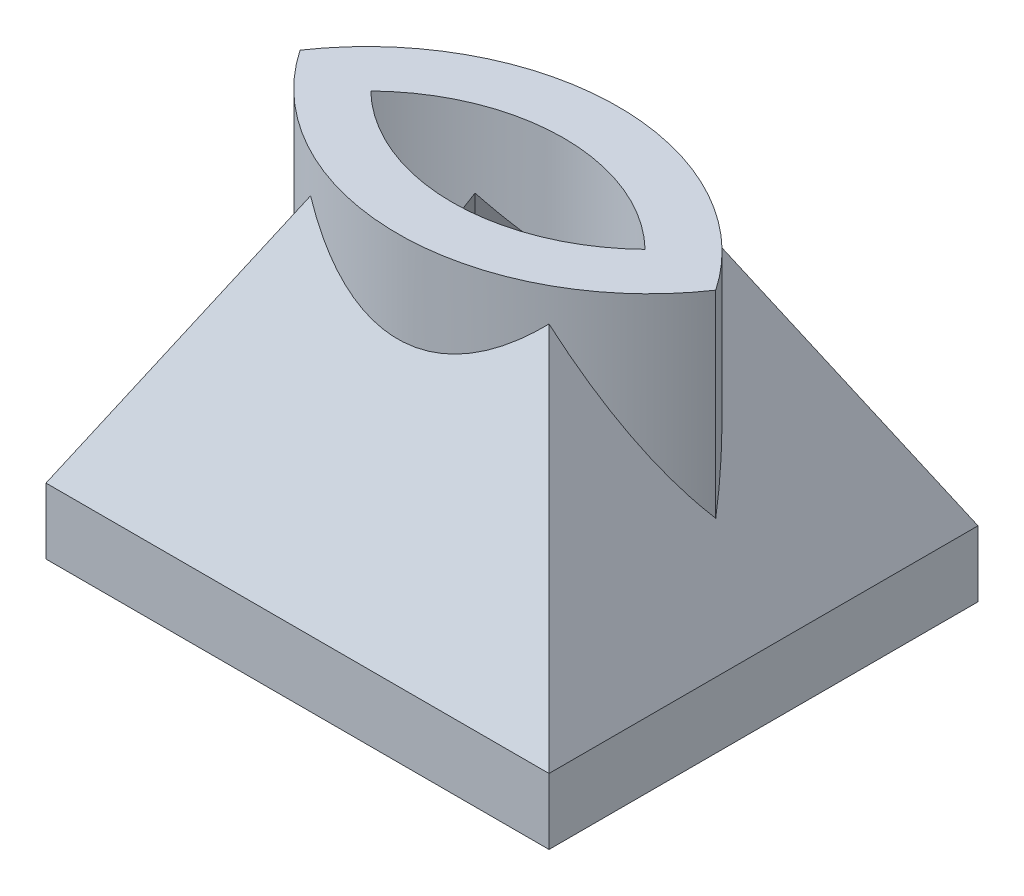
ISO-10303-21;
HEADER;
FILE_DESCRIPTION(('STEP AP214'),'2;1');
FILE_NAME('part.step','',(''),(''),'','','');
FILE_SCHEMA(('AUTOMOTIVE_DESIGN { 1 0 10303 214 1 1 1 1 }'));
ENDSEC;
DATA;
#1=APPLICATION_CONTEXT('core data for automotive mechanical design processes');
#2=APPLICATION_PROTOCOL_DEFINITION('international standard','automotive_design',2000,#1);
#3=PRODUCT_CONTEXT('',#1,'mechanical');
#4=PRODUCT('Part','Part','',(#3));
#5=PRODUCT_RELATED_PRODUCT_CATEGORY('part','',(#4));
#6=PRODUCT_DEFINITION_FORMATION('','',#4);
#7=PRODUCT_DEFINITION_CONTEXT('part definition',#1,'design');
#8=PRODUCT_DEFINITION('design','',#6,#7);
#9=PRODUCT_DEFINITION_SHAPE('','',#8);
#10=(LENGTH_UNIT() NAMED_UNIT(*) SI_UNIT(.MILLI.,.METRE.));
#11=(NAMED_UNIT(*) PLANE_ANGLE_UNIT() SI_UNIT($,.RADIAN.));
#12=(NAMED_UNIT(*) SI_UNIT($,.STERADIAN.) SOLID_ANGLE_UNIT());
#13=UNCERTAINTY_MEASURE_WITH_UNIT(LENGTH_MEASURE(1.E-05),#10,'distance_accuracy_value','');
#14=(GEOMETRIC_REPRESENTATION_CONTEXT(3) GLOBAL_UNCERTAINTY_ASSIGNED_CONTEXT((#13)) GLOBAL_UNIT_ASSIGNED_CONTEXT((#10,
#11,#12)) REPRESENTATION_CONTEXT('',''));
#15=CARTESIAN_POINT('',(0.,0.,0.));
#16=DIRECTION('',(0.,0.,1.));
#17=DIRECTION('',(1.,0.,0.));
#18=AXIS2_PLACEMENT_3D('',#15,#16,#17);
#19=CARTESIAN_POINT('',(6.96446834675513,20.6036411907753,1.64323381294962));
#20=DIRECTION('',(0.,-1.,0.));
#21=DIRECTION('',(0.,0.,-1.));
#22=AXIS2_PLACEMENT_3D('',#19,#20,#21);
#23=PLANE('',#22);
#24=CARTESIAN_POINT('',(6.96446834675514,20.6036411907753,-6.57792003812731));
#25=DIRECTION('',(0.,-1.,0.));
#26=DIRECTION('',(0.,0.,-1.));
#27=AXIS2_PLACEMENT_3D('',#24,#25,#26);
#28=CIRCLE('',#27,14.6461538510769);
#29=CARTESIAN_POINT('',(19.0856255516733,20.6036411907753,1.64323381294963));
#30=VERTEX_POINT('',#29);
#31=CARTESIAN_POINT('',(-5.15668885816299,20.6036411907753,1.64323381294961));
#32=VERTEX_POINT('',#31);
#33=EDGE_CURVE('E242',#30,#32,#28,.T.);
#34=ORIENTED_EDGE('',*,*,#33,.F.);
#35=CARTESIAN_POINT('',(6.96446834675513,20.6036411907753,9.86438766402655));
#36=DIRECTION('',(0.,-1.,0.));
#37=DIRECTION('',(0.,0.,-1.));
#38=AXIS2_PLACEMENT_3D('',#35,#36,#37);
#39=CIRCLE('',#38,14.6461538510769);
#40=EDGE_CURVE('E43',#30,#32,#39,.F.);
#41=ORIENTED_EDGE('',*,*,#40,.T.);
#42=EDGE_LOOP('',(#34,#41));
#43=FACE_BOUND('',#42,.T.);
#44=CARTESIAN_POINT('',(6.96446834675513,20.6036411907753,9.86438766402655));
#45=DIRECTION('',(0.,1.,0.));
#46=DIRECTION('',(0.,0.,1.));
#47=AXIS2_PLACEMENT_3D('',#44,#45,#46);
#48=CIRCLE('',#47,11.4711538510769);
#49=CARTESIAN_POINT('',(14.9644683487551,20.6036411907753,1.64323381294963));
#50=VERTEX_POINT('',#49);
#51=CARTESIAN_POINT('',(-1.03553165524487,20.6036411907753,1.64323381294961));
#52=VERTEX_POINT('',#51);
#53=EDGE_CURVE('E158',#50,#52,#48,.T.);
#54=ORIENTED_EDGE('',*,*,#53,.F.);
#55=CARTESIAN_POINT('',(6.96446834675514,20.6036411907753,-6.57792003812731));
#56=DIRECTION('',(0.,-1.,0.));
#57=DIRECTION('',(0.,0.,-1.));
#58=AXIS2_PLACEMENT_3D('',#55,#56,#57);
#59=CIRCLE('',#58,11.4711538510769);
#60=EDGE_CURVE('E65',#50,#52,#59,.T.);
#61=ORIENTED_EDGE('',*,*,#60,.T.);
#62=EDGE_LOOP('',(#54,#61));
#63=FACE_BOUND('',#62,.T.);
#64=ADVANCED_FACE('F39',(#43,#63),#23,.F.);
#65=CARTESIAN_POINT('',(-4.29075473110789,4.53857221184521,-10.4946247943775));
#66=DIRECTION('',(0.,0.469471562785892,-0.882947592858927));
#67=DIRECTION('',(0.,0.882947592858927,0.469471562785892));
#68=AXIS2_PLACEMENT_3D('',#65,#66,#67);
#69=PLANE('',#68);
#70=DIRECTION('',(0.424969302544861,0.79925101425589,0.424969302544861));
#71=VECTOR('',#70,1.);
#72=CARTESIAN_POINT('',(-6.58782983492365,5.49075299586723,-9.98834129086614));
#73=LINE('',#72,#71);
#74=CARTESIAN_POINT('',(0.249033509849568,18.3490228283384,-3.15147794609292));
#75=VERTEX_POINT('',#74);
#76=CARTESIAN_POINT('',(-7.46575473110789,3.8396164090271,-10.8662661870504));
#77=VERTEX_POINT('',#76);
#78=EDGE_CURVE('E251',#75,#77,#73,.F.);
#79=ORIENTED_EDGE('',*,*,#78,.F.);
#80=CARTESIAN_POINT('',(6.96446834675513,42.8283057506812,9.86438766402655));
#81=DIRECTION('',(0.,0.469471562785892,-0.882947592858927));
#82=DIRECTION('',(0.,-0.882947592858927,-0.469471562785892));
#83=AXIS2_PLACEMENT_3D('',#80,#81,#82);
#84=ELLIPSE('',#83,31.1971054522774,14.6461538510769);
#85=CARTESIAN_POINT('',(13.991117593517,18.6599810784132,-2.98613851167524));
#86=VERTEX_POINT('',#85);
#87=EDGE_CURVE('E255',#75,#86,#84,.F.);
#88=ORIENTED_EDGE('',*,*,#87,.T.);
#89=DIRECTION('',(-0.424969302544861,0.79925101425589,0.424969302544861));
#90=VECTOR('',#89,1.);
#91=CARTESIAN_POINT('',(20.1790901955144,7.02209723899865,-9.17411111367265));
#92=LINE('',#91,#90);
#93=CARTESIAN_POINT('',(21.8712452688921,3.8396164090271,-10.8662661870504));
#94=VERTEX_POINT('',#93);
#95=EDGE_CURVE('E49',#86,#94,#92,.F.);
#96=ORIENTED_EDGE('',*,*,#95,.T.);
#97=DIRECTION('',(1.,0.,0.));
#98=VECTOR('',#97,1.);
#99=CARTESIAN_POINT('',(-4.29075473110789,3.8396164090271,-10.8662661870504));
#100=LINE('',#99,#98);
#101=EDGE_CURVE('E262',#77,#94,#100,.T.);
#102=ORIENTED_EDGE('',*,*,#101,.F.);
#103=EDGE_LOOP('',(#79,#88,#96,#102));
#104=FACE_BOUND('',#103,.T.);
#105=ADVANCED_FACE('F377',(#104),#69,.T.);
#106=CARTESIAN_POINT('',(-4.29075473110788,4.53857221184521,13.7810924202767));
#107=DIRECTION('',(0.,0.469471562785892,0.882947592858927));
#108=DIRECTION('',(0.,-0.882947592858927,0.469471562785892));
#109=AXIS2_PLACEMENT_3D('',#106,#107,#108);
#110=PLANE('',#109);
#111=DIRECTION('',(0.424969302544861,-0.79925101425589,0.424969302544861));
#112=VECTOR('',#111,1.);
#113=CARTESIAN_POINT('',(18.4359495344804,10.3004680130265,10.7174380785379));
#114=LINE('',#113,#112);
#115=CARTESIAN_POINT('',(13.991117593517,18.6599810784132,6.27260613757448));
#116=VERTEX_POINT('',#115);
#117=CARTESIAN_POINT('',(21.8712452688921,3.8396164090271,14.1527338129496));
#118=VERTEX_POINT('',#117);
#119=EDGE_CURVE('E11',#116,#118,#114,.T.);
#120=ORIENTED_EDGE('',*,*,#119,.F.);
#121=CARTESIAN_POINT('',(6.96446834675514,42.8283057506813,-6.57792003812731));
#122=DIRECTION('',(0.,0.469471562785892,0.882947592858927));
#123=DIRECTION('',(0.,-0.882947592858927,0.469471562785892));
#124=AXIS2_PLACEMENT_3D('',#121,#122,#123);
#125=ELLIPSE('',#124,31.1971054522774,14.6461538510769);
#126=CARTESIAN_POINT('',(0.249033509849575,18.3490228283384,6.43794557199216));
#127=VERTEX_POINT('',#126);
#128=EDGE_CURVE('E275',#116,#127,#125,.F.);
#129=ORIENTED_EDGE('',*,*,#128,.T.);
#130=DIRECTION('',(-0.424969302544861,-0.79925101425589,0.424969302544861));
#131=VECTOR('',#130,1.);
#132=CARTESIAN_POINT('',(-6.58782983492364,5.49075299586723,13.2748089167654));
#133=LINE('',#132,#131);
#134=CARTESIAN_POINT('',(-7.46575473110788,3.8396164090271,14.1527338129496));
#135=VERTEX_POINT('',#134);
#136=EDGE_CURVE('E254',#127,#135,#133,.T.);
#137=ORIENTED_EDGE('',*,*,#136,.T.);
#138=DIRECTION('',(-1.,0.,0.));
#139=VECTOR('',#138,1.);
#140=CARTESIAN_POINT('',(-4.29075473110788,3.8396164090271,14.1527338129496));
#141=LINE('',#140,#139);
#142=EDGE_CURVE('E280',#135,#118,#141,.F.);
#143=ORIENTED_EDGE('',*,*,#142,.T.);
#144=EDGE_LOOP('',(#120,#129,#137,#143));
#145=FACE_BOUND('',#144,.T.);
#146=ADVANCED_FACE('F354',(#145),#110,.T.);
#147=CARTESIAN_POINT('',(21.4996038762192,4.53857221184521,-3.18276618705038));
#148=DIRECTION('',(0.882947592858927,0.469471562785892,0.));
#149=DIRECTION('',(-0.469471562785892,0.882947592858927,0.));
#150=AXIS2_PLACEMENT_3D('',#147,#148,#149);
#151=PLANE('',#150);
#152=CARTESIAN_POINT('',(6.96446834675513,31.875186279504,9.86438766402655));
#153=DIRECTION('',(0.882947592858927,0.469471562785892,0.));
#154=DIRECTION('',(0.469471562785892,-0.882947592858927,0.));
#155=AXIS2_PLACEMENT_3D('',#152,#153,#154);
#156=ELLIPSE('',#155,31.1971054522774,14.6461538510769);
#157=CARTESIAN_POINT('',(19.0856255516733,9.07860513359116,1.64323381294963));
#158=VERTEX_POINT('',#157);
#159=EDGE_CURVE('E258',#158,#86,#156,.T.);
#160=ORIENTED_EDGE('',*,*,#159,.F.);
#161=CARTESIAN_POINT('',(6.96446834675514,31.875186279504,-6.57792003812731));
#162=DIRECTION('',(0.882947592858927,0.469471562785892,0.));
#163=DIRECTION('',(0.469471562785892,-0.882947592858927,0.));
#164=AXIS2_PLACEMENT_3D('',#161,#162,#163);
#165=ELLIPSE('',#164,31.1971054522774,14.6461538510769);
#166=EDGE_CURVE('E272',#158,#116,#165,.F.);
#167=ORIENTED_EDGE('',*,*,#166,.T.);
#168=ORIENTED_EDGE('',*,*,#119,.T.);
#169=DIRECTION('',(0.,0.,1.));
#170=VECTOR('',#169,1.);
#171=CARTESIAN_POINT('',(21.8712452688921,3.8396164090271,-3.18276618705038));
#172=LINE('',#171,#170);
#173=EDGE_CURVE('E267',#118,#94,#172,.F.);
#174=ORIENTED_EDGE('',*,*,#173,.T.);
#175=ORIENTED_EDGE('',*,*,#95,.F.);
#176=EDGE_LOOP('',(#160,#167,#168,#174,#175));
#177=FACE_BOUND('',#176,.T.);
#178=ADVANCED_FACE('F375',(#177),#151,.T.);
#179=CARTESIAN_POINT('',(-7.09411333843498,4.53857221184521,-7.69126618705038));
#180=DIRECTION('',(-0.882947592858927,0.469471562785892,0.));
#181=DIRECTION('',(-0.469471562785892,-0.882947592858927,0.));
#182=AXIS2_PLACEMENT_3D('',#179,#180,#181);
#183=PLANE('',#182);
#184=ORIENTED_EDGE('',*,*,#136,.F.);
#185=CARTESIAN_POINT('',(6.96446834675514,30.9789188524154,-6.57792003812731));
#186=DIRECTION('',(-0.882947592858927,0.469471562785892,0.));
#187=DIRECTION('',(-0.469471562785892,-0.882947592858927,0.));
#188=AXIS2_PLACEMENT_3D('',#185,#186,#187);
#189=ELLIPSE('',#188,31.1971054522774,14.6461538510769);
#190=CARTESIAN_POINT('',(-5.15668885816299,8.18233770650259,1.64323381294962));
#191=VERTEX_POINT('',#190);
#192=EDGE_CURVE('E271',#127,#191,#189,.F.);
#193=ORIENTED_EDGE('',*,*,#192,.T.);
#194=CARTESIAN_POINT('',(6.96446834675513,30.9789188524154,9.86438766402655));
#195=DIRECTION('',(-0.882947592858927,0.469471562785892,0.));
#196=DIRECTION('',(-0.469471562785892,-0.882947592858927,0.));
#197=AXIS2_PLACEMENT_3D('',#194,#195,#196);
#198=ELLIPSE('',#197,31.1971054522774,14.6461538510769);
#199=EDGE_CURVE('E259',#75,#191,#198,.T.);
#200=ORIENTED_EDGE('',*,*,#199,.F.);
#201=ORIENTED_EDGE('',*,*,#78,.T.);
#202=DIRECTION('',(0.,0.,-1.));
#203=VECTOR('',#202,1.);
#204=CARTESIAN_POINT('',(-7.46575473110789,3.8396164090271,-7.69126618705038));
#205=LINE('',#204,#203);
#206=EDGE_CURVE('E266',#77,#135,#205,.F.);
#207=ORIENTED_EDGE('',*,*,#206,.T.);
#208=EDGE_LOOP('',(#184,#193,#200,#201,#207));
#209=FACE_BOUND('',#208,.T.);
#210=ADVANCED_FACE('F349',(#209),#183,.T.);
#211=CARTESIAN_POINT('',(-4.29075473110788,0.,14.1527338129496));
#212=DIRECTION('',(0.,0.,1.));
#213=DIRECTION('',(1.,0.,0.));
#214=AXIS2_PLACEMENT_3D('',#211,#212,#213);
#215=PLANE('',#214);
#216=ORIENTED_EDGE('',*,*,#142,.F.);
#217=DIRECTION('',(0.,1.,0.));
#218=VECTOR('',#217,1.);
#219=CARTESIAN_POINT('',(-7.46575473110788,0.,14.1527338129496));
#220=LINE('',#219,#218);
#221=CARTESIAN_POINT('',(-7.46575473110788,0.,14.1527338129496));
#222=VERTEX_POINT('',#221);
#223=EDGE_CURVE('E288',#222,#135,#220,.T.);
#224=ORIENTED_EDGE('',*,*,#223,.F.);
#225=DIRECTION('',(1.,0.,0.));
#226=VECTOR('',#225,1.);
#227=CARTESIAN_POINT('',(0.,0.,14.1527338129496));
#228=LINE('',#227,#226);
#229=CARTESIAN_POINT('',(21.8712452688921,0.,14.1527338129496));
#230=VERTEX_POINT('',#229);
#231=EDGE_CURVE('E274',#222,#230,#228,.T.);
#232=ORIENTED_EDGE('',*,*,#231,.T.);
#233=DIRECTION('',(0.,1.,0.));
#234=VECTOR('',#233,1.);
#235=CARTESIAN_POINT('',(21.8712452688921,0.,14.1527338129496));
#236=LINE('',#235,#234);
#237=EDGE_CURVE('E302',#230,#118,#236,.T.);
#238=ORIENTED_EDGE('',*,*,#237,.T.);
#239=EDGE_LOOP('',(#216,#224,#232,#238));
#240=FACE_BOUND('',#239,.T.);
#241=ADVANCED_FACE('F362',(#240),#215,.T.);
#242=CARTESIAN_POINT('',(-7.46575473110789,0.,-7.69126618705038));
#243=DIRECTION('',(-1.,0.,0.));
#244=DIRECTION('',(0.,0.,1.));
#245=AXIS2_PLACEMENT_3D('',#242,#243,#244);
#246=PLANE('',#245);
#247=ORIENTED_EDGE('',*,*,#206,.F.);
#248=DIRECTION('',(0.,1.,0.));
#249=VECTOR('',#248,1.);
#250=CARTESIAN_POINT('',(-7.46575473110789,0.,-10.8662661870504));
#251=LINE('',#250,#249);
#252=CARTESIAN_POINT('',(-7.46575473110789,0.,-10.8662661870504));
#253=VERTEX_POINT('',#252);
#254=EDGE_CURVE('E301',#253,#77,#251,.T.);
#255=ORIENTED_EDGE('',*,*,#254,.F.);
#256=DIRECTION('',(0.,0.,1.));
#257=VECTOR('',#256,1.);
#258=CARTESIAN_POINT('',(-7.46575473110788,0.,0.));
#259=LINE('',#258,#257);
#260=EDGE_CURVE('E307',#253,#222,#259,.T.);
#261=ORIENTED_EDGE('',*,*,#260,.T.);
#262=ORIENTED_EDGE('',*,*,#223,.T.);
#263=EDGE_LOOP('',(#247,#255,#261,#262));
#264=FACE_BOUND('',#263,.T.);
#265=ADVANCED_FACE('F357',(#264),#246,.T.);
#266=CARTESIAN_POINT('',(-4.29075473110789,0.,-10.8662661870504));
#267=DIRECTION('',(0.,0.,1.));
#268=DIRECTION('',(1.,0.,0.));
#269=AXIS2_PLACEMENT_3D('',#266,#267,#268);
#270=PLANE('',#269);
#271=ORIENTED_EDGE('',*,*,#101,.T.);
#272=DIRECTION('',(0.,1.,0.));
#273=VECTOR('',#272,1.);
#274=CARTESIAN_POINT('',(21.8712452688921,0.,-10.8662661870504));
#275=LINE('',#274,#273);
#276=CARTESIAN_POINT('',(21.8712452688921,0.,-10.8662661870504));
#277=VERTEX_POINT('',#276);
#278=EDGE_CURVE('E306',#277,#94,#275,.T.);
#279=ORIENTED_EDGE('',*,*,#278,.F.);
#280=DIRECTION('',(1.,0.,0.));
#281=VECTOR('',#280,1.);
#282=CARTESIAN_POINT('',(0.,0.,-10.8662661870504));
#283=LINE('',#282,#281);
#284=EDGE_CURVE('E328',#253,#277,#283,.T.);
#285=ORIENTED_EDGE('',*,*,#284,.F.);
#286=ORIENTED_EDGE('',*,*,#254,.T.);
#287=EDGE_LOOP('',(#271,#279,#285,#286));
#288=FACE_BOUND('',#287,.T.);
#289=ADVANCED_FACE('F372',(#288),#270,.F.);
#290=CARTESIAN_POINT('',(21.8712452688921,0.,-3.18276618705038));
#291=DIRECTION('',(1.,0.,0.));
#292=DIRECTION('',(0.,0.,-1.));
#293=AXIS2_PLACEMENT_3D('',#290,#291,#292);
#294=PLANE('',#293);
#295=ORIENTED_EDGE('',*,*,#173,.F.);
#296=ORIENTED_EDGE('',*,*,#237,.F.);
#297=DIRECTION('',(0.,0.,-1.));
#298=VECTOR('',#297,1.);
#299=CARTESIAN_POINT('',(21.8712452688921,0.,0.));
#300=LINE('',#299,#298);
#301=EDGE_CURVE('E324',#230,#277,#300,.T.);
#302=ORIENTED_EDGE('',*,*,#301,.T.);
#303=ORIENTED_EDGE('',*,*,#278,.T.);
#304=EDGE_LOOP('',(#295,#296,#302,#303));
#305=FACE_BOUND('',#304,.T.);
#306=ADVANCED_FACE('F366',(#305),#294,.T.);
#307=CARTESIAN_POINT('',(0.,0.,0.));
#308=DIRECTION('',(0.,1.,0.));
#309=DIRECTION('',(0.,0.,1.));
#310=AXIS2_PLACEMENT_3D('',#307,#308,#309);
#311=PLANE('',#310);
#312=DIRECTION('',(0.,0.,1.));
#313=VECTOR('',#312,1.);
#314=CARTESIAN_POINT('',(-4.29075473110789,0.,-7.69126618705038));
#315=LINE('',#314,#313);
#316=CARTESIAN_POINT('',(-4.29075473110789,0.,-7.69126618705038));
#317=VERTEX_POINT('',#316);
#318=CARTESIAN_POINT('',(-4.29075473110788,0.,10.9777338129496));
#319=VERTEX_POINT('',#318);
#320=EDGE_CURVE('E205',#317,#319,#315,.T.);
#321=ORIENTED_EDGE('',*,*,#320,.T.);
#322=DIRECTION('',(1.,0.,0.));
#323=VECTOR('',#322,1.);
#324=CARTESIAN_POINT('',(-4.29075473110788,0.,10.9777338129496));
#325=LINE('',#324,#323);
#326=CARTESIAN_POINT('',(18.6962452688921,0.,10.9777338129496));
#327=VERTEX_POINT('',#326);
#328=EDGE_CURVE('E194',#319,#327,#325,.T.);
#329=ORIENTED_EDGE('',*,*,#328,.T.);
#330=DIRECTION('',(0.,0.,-1.));
#331=VECTOR('',#330,1.);
#332=CARTESIAN_POINT('',(18.6962452688921,0.,10.9777338129496));
#333=LINE('',#332,#331);
#334=CARTESIAN_POINT('',(18.6962452688921,0.,-7.69126618705038));
#335=VERTEX_POINT('',#334);
#336=EDGE_CURVE('E198',#327,#335,#333,.T.);
#337=ORIENTED_EDGE('',*,*,#336,.T.);
#338=DIRECTION('',(1.,0.,0.));
#339=VECTOR('',#338,1.);
#340=CARTESIAN_POINT('',(-4.29075473110789,0.,-7.69126618705038));
#341=LINE('',#340,#339);
#342=EDGE_CURVE('E202',#317,#335,#341,.T.);
#343=ORIENTED_EDGE('',*,*,#342,.F.);
#344=EDGE_LOOP('',(#321,#329,#337,#343));
#345=FACE_BOUND('',#344,.T.);
#346=ORIENTED_EDGE('',*,*,#231,.F.);
#347=ORIENTED_EDGE('',*,*,#260,.F.);
#348=ORIENTED_EDGE('',*,*,#284,.T.);
#349=ORIENTED_EDGE('',*,*,#301,.F.);
#350=EDGE_LOOP('',(#346,#347,#348,#349));
#351=FACE_BOUND('',#350,.T.);
#352=ADVANCED_FACE('F368',(#345,#351),#311,.F.);
#353=CARTESIAN_POINT('',(6.96446834675514,20.6036411907753,-6.57792003812731));
#354=DIRECTION('',(0.,-1.,0.));
#355=DIRECTION('',(0.,0.,-1.));
#356=AXIS2_PLACEMENT_3D('',#353,#354,#355);
#357=CYLINDRICAL_SURFACE('',#356,14.6461538510769);
#358=ORIENTED_EDGE('',*,*,#166,.F.);
#359=DIRECTION('',(0.,-1.,0.));
#360=VECTOR('',#359,1.);
#361=CARTESIAN_POINT('',(19.0856255516733,20.6036411907753,1.64323381294963));
#362=LINE('',#361,#360);
#363=EDGE_CURVE('E294',#30,#158,#362,.T.);
#364=ORIENTED_EDGE('',*,*,#363,.F.);
#365=ORIENTED_EDGE('',*,*,#33,.T.);
#366=DIRECTION('',(0.,-1.,0.));
#367=VECTOR('',#366,1.);
#368=CARTESIAN_POINT('',(-5.15668885816299,20.6036411907753,1.64323381294961));
#369=LINE('',#368,#367);
#370=EDGE_CURVE('E317',#32,#191,#369,.T.);
#371=ORIENTED_EDGE('',*,*,#370,.T.);
#372=ORIENTED_EDGE('',*,*,#192,.F.);
#373=ORIENTED_EDGE('',*,*,#128,.F.);
#374=EDGE_LOOP('',(#358,#364,#365,#371,#372,#373));
#375=FACE_BOUND('',#374,.T.);
#376=ADVANCED_FACE('F345',(#375),#357,.T.);
#377=CARTESIAN_POINT('',(6.96446834675513,20.6036411907753,9.86438766402655));
#378=DIRECTION('',(0.,-1.,0.));
#379=DIRECTION('',(0.,0.,-1.));
#380=AXIS2_PLACEMENT_3D('',#377,#378,#379);
#381=CYLINDRICAL_SURFACE('',#380,14.6461538510769);
#382=ORIENTED_EDGE('',*,*,#363,.T.);
#383=ORIENTED_EDGE('',*,*,#159,.T.);
#384=ORIENTED_EDGE('',*,*,#87,.F.);
#385=ORIENTED_EDGE('',*,*,#199,.T.);
#386=ORIENTED_EDGE('',*,*,#370,.F.);
#387=ORIENTED_EDGE('',*,*,#40,.F.);
#388=EDGE_LOOP('',(#382,#383,#384,#385,#386,#387));
#389=FACE_BOUND('',#388,.T.);
#390=ADVANCED_FACE('F41',(#389),#381,.T.);
#391=CARTESIAN_POINT('',(-4.29075473110789,3.048,-7.69126618705038));
#392=DIRECTION('',(0.,0.469471562785892,-0.882947592858927));
#393=DIRECTION('',(0.,0.882947592858927,0.469471562785892));
#394=AXIS2_PLACEMENT_3D('',#391,#392,#393);
#395=PLANE('',#394);
#396=DIRECTION('',(0.424969302544861,0.79925101425589,0.424969302544861));
#397=VECTOR('',#396,1.);
#398=CARTESIAN_POINT('',(-4.29075473110789,3.048,-7.69126618705038));
#399=LINE('',#398,#397);
#400=CARTESIAN_POINT('',(2.64007147883521,16.082988279756,-0.760439977107278));
#401=VERTEX_POINT('',#400);
#402=CARTESIAN_POINT('',(-4.29075473110789,3.048,-7.69126618705038));
#403=VERTEX_POINT('',#402);
#404=EDGE_CURVE('E246',#401,#403,#399,.F.);
#405=ORIENTED_EDGE('',*,*,#404,.T.);
#406=DIRECTION('',(1.,0.,0.));
#407=VECTOR('',#406,1.);
#408=CARTESIAN_POINT('',(-4.29075473110789,3.048,-7.69126618705038));
#409=LINE('',#408,#407);
#410=CARTESIAN_POINT('',(18.6962452688921,3.048,-7.69126618705038));
#411=VERTEX_POINT('',#410);
#412=EDGE_CURVE('E230',#403,#411,#409,.T.);
#413=ORIENTED_EDGE('',*,*,#412,.T.);
#414=DIRECTION('',(-0.424969302544861,0.79925101425589,0.424969302544861));
#415=VECTOR('',#414,1.);
#416=CARTESIAN_POINT('',(17.8820150916986,4.57934424313143,-6.87703600985689));
#417=LINE('',#416,#415);
#418=CARTESIAN_POINT('',(11.6231507099768,16.3505561288491,-0.61817162813509));
#419=VERTEX_POINT('',#418);
#420=EDGE_CURVE('E243',#419,#411,#417,.F.);
#421=ORIENTED_EDGE('',*,*,#420,.F.);
#422=CARTESIAN_POINT('',(6.96446834675513,36.0653828141796,9.86438766402655));
#423=DIRECTION('',(0.,0.469471562785892,-0.882947592858927));
#424=DIRECTION('',(0.,-0.882947592858927,-0.469471562785892));
#425=AXIS2_PLACEMENT_3D('',#422,#423,#424);
#426=ELLIPSE('',#425,24.4341825157757,11.4711538510769);
#427=EDGE_CURVE('E179',#401,#419,#426,.F.);
#428=ORIENTED_EDGE('',*,*,#427,.F.);
#429=EDGE_LOOP('',(#405,#413,#421,#428));
#430=FACE_BOUND('',#429,.T.);
#431=ADVANCED_FACE('F404',(#430),#395,.F.);
#432=CARTESIAN_POINT('',(-4.29075473110788,3.048,10.9777338129496));
#433=DIRECTION('',(0.,0.469471562785892,0.882947592858927));
#434=DIRECTION('',(0.,-0.882947592858927,0.469471562785892));
#435=AXIS2_PLACEMENT_3D('',#432,#433,#434);
#436=PLANE('',#435);
#437=DIRECTION('',(0.424969302544861,-0.79925101425589,0.424969302544861));
#438=VECTOR('',#437,1.);
#439=CARTESIAN_POINT('',(16.1388744306647,7.85771501715927,8.42036297472217));
#440=LINE('',#439,#438);
#441=CARTESIAN_POINT('',(11.6231507099768,16.3505561288491,3.90463925403433));
#442=VERTEX_POINT('',#441);
#443=CARTESIAN_POINT('',(18.6962452688921,3.048,10.9777338129496));
#444=VERTEX_POINT('',#443);
#445=EDGE_CURVE('E239',#442,#444,#440,.T.);
#446=ORIENTED_EDGE('',*,*,#445,.T.);
#447=DIRECTION('',(1.,0.,0.));
#448=VECTOR('',#447,1.);
#449=CARTESIAN_POINT('',(-4.29075473110788,3.048,10.9777338129496));
#450=LINE('',#449,#448);
#451=CARTESIAN_POINT('',(-4.29075473110788,3.048,10.9777338129496));
#452=VERTEX_POINT('',#451);
#453=EDGE_CURVE('E214',#452,#444,#450,.T.);
#454=ORIENTED_EDGE('',*,*,#453,.F.);
#455=DIRECTION('',(-0.424969302544861,-0.79925101425589,0.424969302544861));
#456=VECTOR('',#455,1.);
#457=CARTESIAN_POINT('',(-4.29075473110788,3.048,10.9777338129496));
#458=LINE('',#457,#456);
#459=CARTESIAN_POINT('',(2.64007147883522,16.082988279756,4.04690760300652));
#460=VERTEX_POINT('',#459);
#461=EDGE_CURVE('E238',#460,#452,#458,.T.);
#462=ORIENTED_EDGE('',*,*,#461,.F.);
#463=CARTESIAN_POINT('',(6.96446834675514,36.0653828141796,-6.57792003812731));
#464=DIRECTION('',(0.,0.469471562785892,0.882947592858927));
#465=DIRECTION('',(0.,-0.882947592858927,0.469471562785892));
#466=AXIS2_PLACEMENT_3D('',#463,#464,#465);
#467=ELLIPSE('',#466,24.4341825157757,11.4711538510769);
#468=EDGE_CURVE('E188',#442,#460,#467,.F.);
#469=ORIENTED_EDGE('',*,*,#468,.F.);
#470=EDGE_LOOP('',(#446,#454,#462,#469));
#471=FACE_BOUND('',#470,.T.);
#472=ADVANCED_FACE('F434',(#471),#436,.F.);
#473=CARTESIAN_POINT('',(18.6962452688921,3.048,-3.18276618705038));
#474=DIRECTION('',(0.882947592858927,0.469471562785892,0.));
#475=DIRECTION('',(-0.469471562785892,0.882947592858927,0.));
#476=AXIS2_PLACEMENT_3D('',#473,#474,#475);
#477=PLANE('',#476);
#478=CARTESIAN_POINT('',(6.96446834675513,25.1122633430023,9.86438766402655));
#479=DIRECTION('',(0.882947592858927,0.469471562785892,0.));
#480=DIRECTION('',(0.469471562785892,-0.882947592858927,0.));
#481=AXIS2_PLACEMENT_3D('',#478,#479,#480);
#482=ELLIPSE('',#481,24.4341825157757,11.4711538510769);
#483=CARTESIAN_POINT('',(14.9644683487551,10.0664516164702,1.64323381294963));
#484=VERTEX_POINT('',#483);
#485=EDGE_CURVE('E182',#484,#419,#482,.T.);
#486=ORIENTED_EDGE('',*,*,#485,.T.);
#487=ORIENTED_EDGE('',*,*,#420,.T.);
#488=DIRECTION('',(0.,0.,-1.));
#489=VECTOR('',#488,1.);
#490=CARTESIAN_POINT('',(18.6962452688921,3.048,-3.18276618705038));
#491=LINE('',#490,#489);
#492=EDGE_CURVE('E227',#444,#411,#491,.T.);
#493=ORIENTED_EDGE('',*,*,#492,.F.);
#494=ORIENTED_EDGE('',*,*,#445,.F.);
#495=CARTESIAN_POINT('',(6.96446834675514,25.1122633430023,-6.57792003812731));
#496=DIRECTION('',(0.882947592858927,0.469471562785892,0.));
#497=DIRECTION('',(0.469471562785892,-0.882947592858927,0.));
#498=AXIS2_PLACEMENT_3D('',#495,#496,#497);
#499=ELLIPSE('',#498,24.4341825157757,11.4711538510769);
#500=EDGE_CURVE('E191',#484,#442,#499,.F.);
#501=ORIENTED_EDGE('',*,*,#500,.F.);
#502=EDGE_LOOP('',(#486,#487,#493,#494,#501));
#503=FACE_BOUND('',#502,.T.);
#504=ADVANCED_FACE('F437',(#503),#477,.F.);
#505=CARTESIAN_POINT('',(-4.29075473110789,3.048,-7.69126618705038));
#506=DIRECTION('',(-0.882947592858927,0.469471562785892,0.));
#507=DIRECTION('',(-0.469471562785892,-0.882947592858927,0.));
#508=AXIS2_PLACEMENT_3D('',#505,#506,#507);
#509=PLANE('',#508);
#510=ORIENTED_EDGE('',*,*,#461,.T.);
#511=DIRECTION('',(0.,0.,1.));
#512=VECTOR('',#511,1.);
#513=CARTESIAN_POINT('',(-4.29075473110789,3.048,-7.69126618705038));
#514=LINE('',#513,#512);
#515=EDGE_CURVE('E234',#403,#452,#514,.T.);
#516=ORIENTED_EDGE('',*,*,#515,.F.);
#517=ORIENTED_EDGE('',*,*,#404,.F.);
#518=CARTESIAN_POINT('',(6.96446834675513,24.2159959159137,9.86438766402655));
#519=DIRECTION('',(-0.882947592858927,0.469471562785892,0.));
#520=DIRECTION('',(-0.469471562785892,-0.882947592858927,0.));
#521=AXIS2_PLACEMENT_3D('',#518,#519,#520);
#522=ELLIPSE('',#521,24.4341825157757,11.4711538510769);
#523=CARTESIAN_POINT('',(-1.03553165524487,9.17018418938165,1.64323381294961));
#524=VERTEX_POINT('',#523);
#525=EDGE_CURVE('E175',#401,#524,#522,.T.);
#526=ORIENTED_EDGE('',*,*,#525,.T.);
#527=CARTESIAN_POINT('',(6.96446834675514,24.2159959159137,-6.57792003812731));
#528=DIRECTION('',(-0.882947592858927,0.469471562785892,0.));
#529=DIRECTION('',(-0.469471562785892,-0.882947592858927,0.));
#530=AXIS2_PLACEMENT_3D('',#527,#528,#529);
#531=ELLIPSE('',#530,24.4341825157757,11.4711538510769);
#532=EDGE_CURVE('E167',#460,#524,#531,.F.);
#533=ORIENTED_EDGE('',*,*,#532,.F.);
#534=EDGE_LOOP('',(#510,#516,#517,#526,#533));
#535=FACE_BOUND('',#534,.T.);
#536=ADVANCED_FACE('F433',(#535),#509,.F.);
#537=CARTESIAN_POINT('',(-4.29075473110788,0.,10.9777338129496));
#538=DIRECTION('',(0.,0.,1.));
#539=DIRECTION('',(1.,0.,0.));
#540=AXIS2_PLACEMENT_3D('',#537,#538,#539);
#541=PLANE('',#540);
#542=ORIENTED_EDGE('',*,*,#453,.T.);
#543=DIRECTION('',(0.,1.,0.));
#544=VECTOR('',#543,1.);
#545=CARTESIAN_POINT('',(18.6962452688921,0.,10.9777338129496));
#546=LINE('',#545,#544);
#547=EDGE_CURVE('E209',#327,#444,#546,.T.);
#548=ORIENTED_EDGE('',*,*,#547,.F.);
#549=ORIENTED_EDGE('',*,*,#328,.F.);
#550=DIRECTION('',(0.,1.,0.));
#551=VECTOR('',#550,1.);
#552=CARTESIAN_POINT('',(-4.29075473110788,0.,10.9777338129496));
#553=LINE('',#552,#551);
#554=EDGE_CURVE('E210',#319,#452,#553,.T.);
#555=ORIENTED_EDGE('',*,*,#554,.T.);
#556=EDGE_LOOP('',(#542,#548,#549,#555));
#557=FACE_BOUND('',#556,.T.);
#558=ADVANCED_FACE('F416',(#557),#541,.F.);
#559=CARTESIAN_POINT('',(-4.29075473110789,0.,-7.69126618705038));
#560=DIRECTION('',(-1.,0.,0.));
#561=DIRECTION('',(0.,0.,1.));
#562=AXIS2_PLACEMENT_3D('',#559,#560,#561);
#563=PLANE('',#562);
#564=ORIENTED_EDGE('',*,*,#515,.T.);
#565=ORIENTED_EDGE('',*,*,#554,.F.);
#566=ORIENTED_EDGE('',*,*,#320,.F.);
#567=DIRECTION('',(0.,1.,0.));
#568=VECTOR('',#567,1.);
#569=CARTESIAN_POINT('',(-4.29075473110789,0.,-7.69126618705038));
#570=LINE('',#569,#568);
#571=EDGE_CURVE('E215',#317,#403,#570,.T.);
#572=ORIENTED_EDGE('',*,*,#571,.T.);
#573=EDGE_LOOP('',(#564,#565,#566,#572));
#574=FACE_BOUND('',#573,.T.);
#575=ADVANCED_FACE('F412',(#574),#563,.F.);
#576=CARTESIAN_POINT('',(-4.29075473110789,0.,-7.69126618705038));
#577=DIRECTION('',(0.,0.,1.));
#578=DIRECTION('',(1.,0.,0.));
#579=AXIS2_PLACEMENT_3D('',#576,#577,#578);
#580=PLANE('',#579);
#581=ORIENTED_EDGE('',*,*,#412,.F.);
#582=ORIENTED_EDGE('',*,*,#571,.F.);
#583=ORIENTED_EDGE('',*,*,#342,.T.);
#584=DIRECTION('',(0.,1.,0.));
#585=VECTOR('',#584,1.);
#586=CARTESIAN_POINT('',(18.6962452688921,0.,-7.69126618705038));
#587=LINE('',#586,#585);
#588=EDGE_CURVE('E57',#335,#411,#587,.T.);
#589=ORIENTED_EDGE('',*,*,#588,.T.);
#590=EDGE_LOOP('',(#581,#582,#583,#589));
#591=FACE_BOUND('',#590,.T.);
#592=ADVANCED_FACE('F420',(#591),#580,.T.);
#593=CARTESIAN_POINT('',(18.6962452688921,0.,-3.18276618705038));
#594=DIRECTION('',(1.,0.,0.));
#595=DIRECTION('',(0.,0.,-1.));
#596=AXIS2_PLACEMENT_3D('',#593,#594,#595);
#597=PLANE('',#596);
#598=ORIENTED_EDGE('',*,*,#492,.T.);
#599=ORIENTED_EDGE('',*,*,#588,.F.);
#600=ORIENTED_EDGE('',*,*,#336,.F.);
#601=ORIENTED_EDGE('',*,*,#547,.T.);
#602=EDGE_LOOP('',(#598,#599,#600,#601));
#603=FACE_BOUND('',#602,.T.);
#604=ADVANCED_FACE('F417',(#603),#597,.F.);
#605=CARTESIAN_POINT('',(6.96446834675514,20.6036411907753,-6.57792003812731));
#606=DIRECTION('',(0.,-1.,0.));
#607=DIRECTION('',(0.,0.,-1.));
#608=AXIS2_PLACEMENT_3D('',#605,#606,#607);
#609=CYLINDRICAL_SURFACE('',#608,11.4711538510769);
#610=ORIENTED_EDGE('',*,*,#500,.T.);
#611=ORIENTED_EDGE('',*,*,#468,.T.);
#612=ORIENTED_EDGE('',*,*,#532,.T.);
#613=DIRECTION('',(0.,-1.,0.));
#614=VECTOR('',#613,1.);
#615=CARTESIAN_POINT('',(-1.03553165524487,20.6036411907753,1.64323381294961));
#616=LINE('',#615,#614);
#617=EDGE_CURVE('E160',#52,#524,#616,.T.);
#618=ORIENTED_EDGE('',*,*,#617,.F.);
#619=ORIENTED_EDGE('',*,*,#60,.F.);
#620=DIRECTION('',(0.,-1.,0.));
#621=VECTOR('',#620,1.);
#622=CARTESIAN_POINT('',(14.9644683487551,20.6036411907753,1.64323381294963));
#623=LINE('',#622,#621);
#624=EDGE_CURVE('E161',#50,#484,#623,.T.);
#625=ORIENTED_EDGE('',*,*,#624,.T.);
#626=EDGE_LOOP('',(#610,#611,#612,#618,#619,#625));
#627=FACE_BOUND('',#626,.T.);
#628=ADVANCED_FACE('F165',(#627),#609,.F.);
#629=CARTESIAN_POINT('',(6.96446834675513,20.6036411907753,9.86438766402655));
#630=DIRECTION('',(0.,-1.,0.));
#631=DIRECTION('',(0.,0.,-1.));
#632=AXIS2_PLACEMENT_3D('',#629,#630,#631);
#633=CYLINDRICAL_SURFACE('',#632,11.4711538510769);
#634=ORIENTED_EDGE('',*,*,#624,.F.);
#635=ORIENTED_EDGE('',*,*,#53,.T.);
#636=ORIENTED_EDGE('',*,*,#617,.T.);
#637=ORIENTED_EDGE('',*,*,#525,.F.);
#638=ORIENTED_EDGE('',*,*,#427,.T.);
#639=ORIENTED_EDGE('',*,*,#485,.F.);
#640=EDGE_LOOP('',(#634,#635,#636,#637,#638,#639));
#641=FACE_BOUND('',#640,.T.);
#642=ADVANCED_FACE('F159',(#641),#633,.F.);
#643=CLOSED_SHELL('',(#64,#105,#146,#178,#210,#241,#265,#289,#306,#352,#376,#390,#431,#472,#504,
#536,#558,#575,#592,#604,#628,#642));
#644=MANIFOLD_SOLID_BREP('B2',#643);
#645=ADVANCED_BREP_SHAPE_REPRESENTATION('',(#18,#644),#14);
#646=SHAPE_DEFINITION_REPRESENTATION(#9,#645);
ENDSEC;
END-ISO-10303-21;
